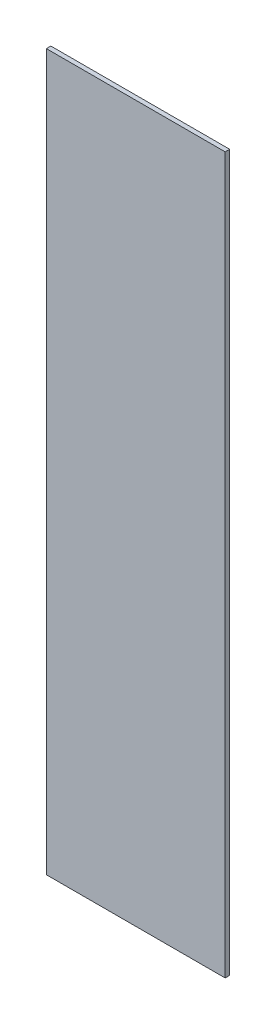
ISO-10303-21;
HEADER;
FILE_DESCRIPTION(('STEP AP214'),'2;1');
FILE_NAME('part.step','',(''),(''),'','','');
FILE_SCHEMA(('AUTOMOTIVE_DESIGN { 1 0 10303 214 1 1 1 1 }'));
ENDSEC;
DATA;
#1=APPLICATION_CONTEXT('core data for automotive mechanical design processes');
#2=APPLICATION_PROTOCOL_DEFINITION('international standard','automotive_design',2000,#1);
#3=PRODUCT_CONTEXT('',#1,'mechanical');
#4=PRODUCT('Part','Part','',(#3));
#5=PRODUCT_RELATED_PRODUCT_CATEGORY('part','',(#4));
#6=PRODUCT_DEFINITION_FORMATION('','',#4);
#7=PRODUCT_DEFINITION_CONTEXT('part definition',#1,'design');
#8=PRODUCT_DEFINITION('design','',#6,#7);
#9=PRODUCT_DEFINITION_SHAPE('','',#8);
#10=(LENGTH_UNIT() NAMED_UNIT(*) SI_UNIT(.MILLI.,.METRE.));
#11=(NAMED_UNIT(*) PLANE_ANGLE_UNIT() SI_UNIT($,.RADIAN.));
#12=(NAMED_UNIT(*) SI_UNIT($,.STERADIAN.) SOLID_ANGLE_UNIT());
#13=UNCERTAINTY_MEASURE_WITH_UNIT(LENGTH_MEASURE(1.E-05),#10,'distance_accuracy_value','');
#14=(GEOMETRIC_REPRESENTATION_CONTEXT(3) GLOBAL_UNCERTAINTY_ASSIGNED_CONTEXT((#13)) GLOBAL_UNIT_ASSIGNED_CONTEXT((#10,
#11,#12)) REPRESENTATION_CONTEXT('',''));
#15=CARTESIAN_POINT('',(0.,0.,0.));
#16=DIRECTION('',(0.,0.,1.));
#17=DIRECTION('',(1.,0.,0.));
#18=AXIS2_PLACEMENT_3D('',#15,#16,#17);
#19=CARTESIAN_POINT('',(0.,0.,3.175));
#20=DIRECTION('',(1.,0.,0.));
#21=DIRECTION('',(0.,0.,-1.));
#22=AXIS2_PLACEMENT_3D('',#19,#20,#21);
#23=PLANE('',#22);
#24=DIRECTION('',(0.,-1.,0.));
#25=VECTOR('',#24,1.);
#26=CARTESIAN_POINT('',(0.,0.,0.));
#27=LINE('',#26,#25);
#28=CARTESIAN_POINT('',(0.,508.,0.));
#29=VERTEX_POINT('',#28);
#30=CARTESIAN_POINT('',(0.,0.,0.));
#31=VERTEX_POINT('',#30);
#32=EDGE_CURVE('E107',#29,#31,#27,.T.);
#33=ORIENTED_EDGE('',*,*,#32,.T.);
#34=DIRECTION('',(0.,0.,-1.));
#35=VECTOR('',#34,1.);
#36=CARTESIAN_POINT('',(0.,0.,3.175));
#37=LINE('',#36,#35);
#38=CARTESIAN_POINT('',(0.,0.,3.175));
#39=VERTEX_POINT('',#38);
#40=EDGE_CURVE('E11',#39,#31,#37,.T.);
#41=ORIENTED_EDGE('',*,*,#40,.F.);
#42=DIRECTION('',(0.,-1.,0.));
#43=VECTOR('',#42,1.);
#44=CARTESIAN_POINT('',(0.,0.,3.175));
#45=LINE('',#44,#43);
#46=CARTESIAN_POINT('',(0.,508.,3.175));
#47=VERTEX_POINT('',#46);
#48=EDGE_CURVE('E91',#47,#39,#45,.T.);
#49=ORIENTED_EDGE('',*,*,#48,.F.);
#50=DIRECTION('',(0.,0.,-1.));
#51=VECTOR('',#50,1.);
#52=CARTESIAN_POINT('',(0.,508.,3.175));
#53=LINE('',#52,#51);
#54=EDGE_CURVE('E103',#47,#29,#53,.T.);
#55=ORIENTED_EDGE('',*,*,#54,.T.);
#56=EDGE_LOOP('',(#33,#41,#49,#55));
#57=FACE_BOUND('',#56,.T.);
#58=ADVANCED_FACE('F39',(#57),#23,.F.);
#59=CARTESIAN_POINT('',(0.,0.,3.175));
#60=DIRECTION('',(0.,1.,0.));
#61=DIRECTION('',(0.,0.,1.));
#62=AXIS2_PLACEMENT_3D('',#59,#60,#61);
#63=PLANE('',#62);
#64=DIRECTION('',(1.,0.,0.));
#65=VECTOR('',#64,1.);
#66=CARTESIAN_POINT('',(0.,0.,0.));
#67=LINE('',#66,#65);
#68=CARTESIAN_POINT('',(127.,0.,0.));
#69=VERTEX_POINT('',#68);
#70=EDGE_CURVE('E96',#31,#69,#67,.T.);
#71=ORIENTED_EDGE('',*,*,#70,.T.);
#72=DIRECTION('',(0.,0.,-1.));
#73=VECTOR('',#72,1.);
#74=CARTESIAN_POINT('',(127.,0.,3.175));
#75=LINE('',#74,#73);
#76=CARTESIAN_POINT('',(127.,0.,3.175));
#77=VERTEX_POINT('',#76);
#78=EDGE_CURVE('E48',#77,#69,#75,.T.);
#79=ORIENTED_EDGE('',*,*,#78,.F.);
#80=DIRECTION('',(1.,0.,0.));
#81=VECTOR('',#80,1.);
#82=CARTESIAN_POINT('',(0.,0.,3.175));
#83=LINE('',#82,#81);
#84=EDGE_CURVE('E86',#39,#77,#83,.T.);
#85=ORIENTED_EDGE('',*,*,#84,.F.);
#86=ORIENTED_EDGE('',*,*,#40,.T.);
#87=EDGE_LOOP('',(#71,#79,#85,#86));
#88=FACE_BOUND('',#87,.T.);
#89=ADVANCED_FACE('F95',(#88),#63,.F.);
#90=CARTESIAN_POINT('',(127.,0.,3.175));
#91=DIRECTION('',(-1.,0.,0.));
#92=DIRECTION('',(0.,0.,1.));
#93=AXIS2_PLACEMENT_3D('',#90,#91,#92);
#94=PLANE('',#93);
#95=DIRECTION('',(0.,1.,0.));
#96=VECTOR('',#95,1.);
#97=CARTESIAN_POINT('',(127.,0.,0.));
#98=LINE('',#97,#96);
#99=CARTESIAN_POINT('',(127.,508.,0.));
#100=VERTEX_POINT('',#99);
#101=EDGE_CURVE('E73',#69,#100,#98,.T.);
#102=ORIENTED_EDGE('',*,*,#101,.T.);
#103=DIRECTION('',(0.,0.,-1.));
#104=VECTOR('',#103,1.);
#105=CARTESIAN_POINT('',(127.,508.,3.175));
#106=LINE('',#105,#104);
#107=CARTESIAN_POINT('',(127.,508.,3.175));
#108=VERTEX_POINT('',#107);
#109=EDGE_CURVE('E98',#108,#100,#106,.T.);
#110=ORIENTED_EDGE('',*,*,#109,.F.);
#111=DIRECTION('',(0.,1.,0.));
#112=VECTOR('',#111,1.);
#113=CARTESIAN_POINT('',(127.,0.,3.175));
#114=LINE('',#113,#112);
#115=EDGE_CURVE('E89',#77,#108,#114,.T.);
#116=ORIENTED_EDGE('',*,*,#115,.F.);
#117=ORIENTED_EDGE('',*,*,#78,.T.);
#118=EDGE_LOOP('',(#102,#110,#116,#117));
#119=FACE_BOUND('',#118,.T.);
#120=ADVANCED_FACE('F99',(#119),#94,.F.);
#121=CARTESIAN_POINT('',(0.,508.,3.175));
#122=DIRECTION('',(0.,-1.,0.));
#123=DIRECTION('',(0.,0.,-1.));
#124=AXIS2_PLACEMENT_3D('',#121,#122,#123);
#125=PLANE('',#124);
#126=DIRECTION('',(-1.,0.,0.));
#127=VECTOR('',#126,1.);
#128=CARTESIAN_POINT('',(0.,508.,0.));
#129=LINE('',#128,#127);
#130=EDGE_CURVE('E79',#100,#29,#129,.T.);
#131=ORIENTED_EDGE('',*,*,#130,.T.);
#132=ORIENTED_EDGE('',*,*,#54,.F.);
#133=DIRECTION('',(-1.,0.,0.));
#134=VECTOR('',#133,1.);
#135=CARTESIAN_POINT('',(0.,508.,3.175));
#136=LINE('',#135,#134);
#137=EDGE_CURVE('E56',#108,#47,#136,.T.);
#138=ORIENTED_EDGE('',*,*,#137,.F.);
#139=ORIENTED_EDGE('',*,*,#109,.T.);
#140=EDGE_LOOP('',(#131,#132,#138,#139));
#141=FACE_BOUND('',#140,.T.);
#142=ADVANCED_FACE('F120',(#141),#125,.F.);
#143=CARTESIAN_POINT('',(0.,0.,3.175));
#144=DIRECTION('',(0.,0.,-1.));
#145=DIRECTION('',(-1.,0.,0.));
#146=AXIS2_PLACEMENT_3D('',#143,#144,#145);
#147=PLANE('',#146);
#148=ORIENTED_EDGE('',*,*,#48,.T.);
#149=ORIENTED_EDGE('',*,*,#84,.T.);
#150=ORIENTED_EDGE('',*,*,#115,.T.);
#151=ORIENTED_EDGE('',*,*,#137,.T.);
#152=EDGE_LOOP('',(#148,#149,#150,#151));
#153=FACE_BOUND('',#152,.T.);
#154=ADVANCED_FACE('F87',(#153),#147,.F.);
#155=CARTESIAN_POINT('',(0.,0.,0.));
#156=DIRECTION('',(0.,0.,-1.));
#157=DIRECTION('',(-1.,0.,0.));
#158=AXIS2_PLACEMENT_3D('',#155,#156,#157);
#159=PLANE('',#158);
#160=ORIENTED_EDGE('',*,*,#32,.F.);
#161=ORIENTED_EDGE('',*,*,#130,.F.);
#162=ORIENTED_EDGE('',*,*,#101,.F.);
#163=ORIENTED_EDGE('',*,*,#70,.F.);
#164=EDGE_LOOP('',(#160,#161,#162,#163));
#165=FACE_BOUND('',#164,.T.);
#166=ADVANCED_FACE('F123',(#165),#159,.T.);
#167=CLOSED_SHELL('',(#58,#89,#120,#142,#154,#166));
#168=MANIFOLD_SOLID_BREP('B2',#167);
#169=ADVANCED_BREP_SHAPE_REPRESENTATION('',(#18,#168),#14);
#170=SHAPE_DEFINITION_REPRESENTATION(#9,#169);
ENDSEC;
END-ISO-10303-21;
